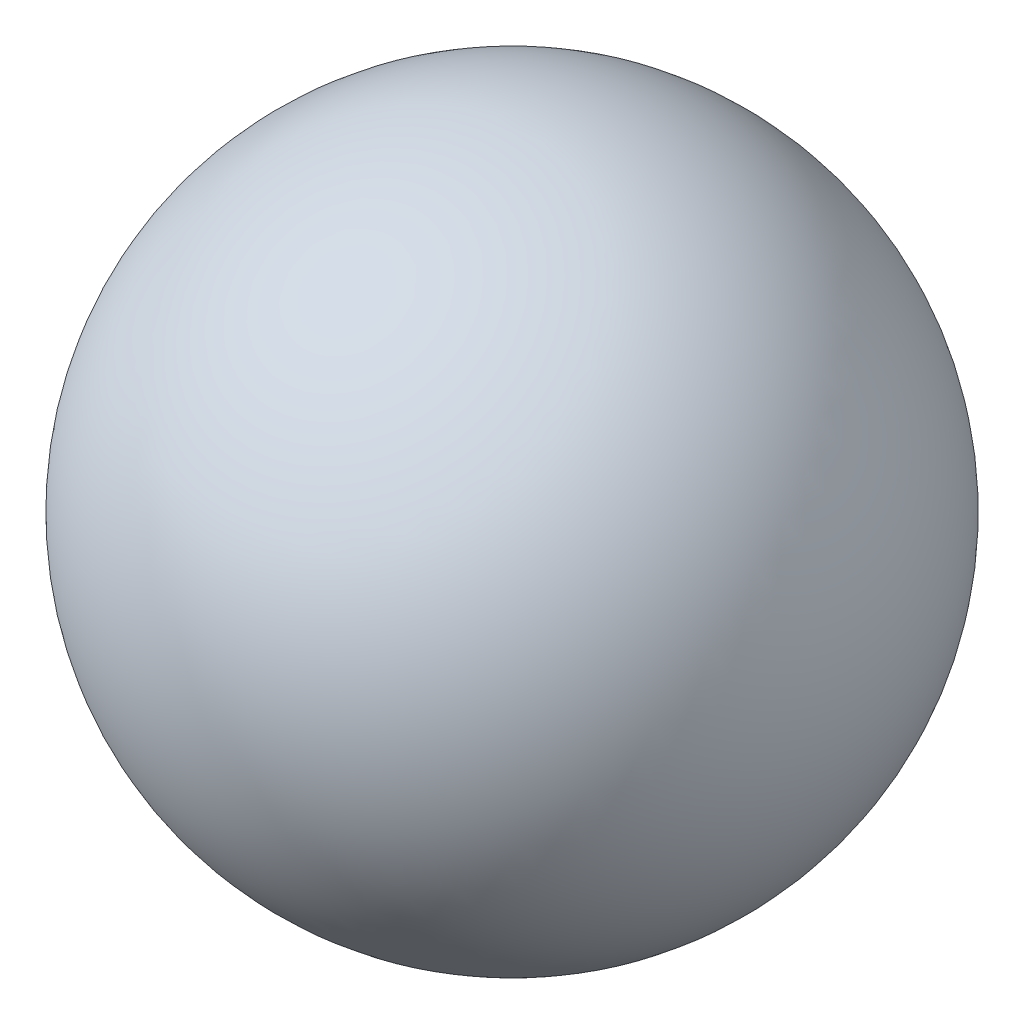
ISO-10303-21;
HEADER;
FILE_DESCRIPTION(('STEP AP214'),'2;1');
FILE_NAME('part.step','',(''),(''),'','','');
FILE_SCHEMA(('AUTOMOTIVE_DESIGN { 1 0 10303 214 1 1 1 1 }'));
ENDSEC;
DATA;
#1=APPLICATION_CONTEXT('core data for automotive mechanical design processes');
#2=APPLICATION_PROTOCOL_DEFINITION('international standard','automotive_design',2000,#1);
#3=PRODUCT_CONTEXT('',#1,'mechanical');
#4=PRODUCT('Part','Part','',(#3));
#5=PRODUCT_RELATED_PRODUCT_CATEGORY('part','',(#4));
#6=PRODUCT_DEFINITION_FORMATION('','',#4);
#7=PRODUCT_DEFINITION_CONTEXT('part definition',#1,'design');
#8=PRODUCT_DEFINITION('design','',#6,#7);
#9=PRODUCT_DEFINITION_SHAPE('','',#8);
#10=(LENGTH_UNIT() NAMED_UNIT(*) SI_UNIT(.MILLI.,.METRE.));
#11=(NAMED_UNIT(*) PLANE_ANGLE_UNIT() SI_UNIT($,.RADIAN.));
#12=(NAMED_UNIT(*) SI_UNIT($,.STERADIAN.) SOLID_ANGLE_UNIT());
#13=UNCERTAINTY_MEASURE_WITH_UNIT(LENGTH_MEASURE(1.E-05),#10,'distance_accuracy_value','');
#14=(GEOMETRIC_REPRESENTATION_CONTEXT(3) GLOBAL_UNCERTAINTY_ASSIGNED_CONTEXT((#13)) GLOBAL_UNIT_ASSIGNED_CONTEXT((#10,
#11,#12)) REPRESENTATION_CONTEXT('',''));
#15=CARTESIAN_POINT('',(0.,0.,0.));
#16=DIRECTION('',(0.,0.,1.));
#17=DIRECTION('',(1.,0.,0.));
#18=AXIS2_PLACEMENT_3D('',#15,#16,#17);
#19=CARTESIAN_POINT('',(0.,0.,0.));
#20=DIRECTION('',(0.,1.,0.));
#21=DIRECTION('',(-1.,0.,0.));
#22=AXIS2_PLACEMENT_3D('',#19,#20,#21);
#23=SPHERICAL_SURFACE('',#22,21.);
#24=CARTESIAN_POINT('',(0.,21.,0.));
#25=VERTEX_POINT('',#24);
#26=VERTEX_LOOP('',#25);
#27=FACE_BOUND('',#26,.T.);
#28=ADVANCED_FACE('F34',(#27),#23,.T.);
#29=CLOSED_SHELL('',(#28));
#30=MANIFOLD_SOLID_BREP('B2',#29);
#31=ADVANCED_BREP_SHAPE_REPRESENTATION('',(#18,#30),#14);
#32=SHAPE_DEFINITION_REPRESENTATION(#9,#31);
ENDSEC;
END-ISO-10303-21;
